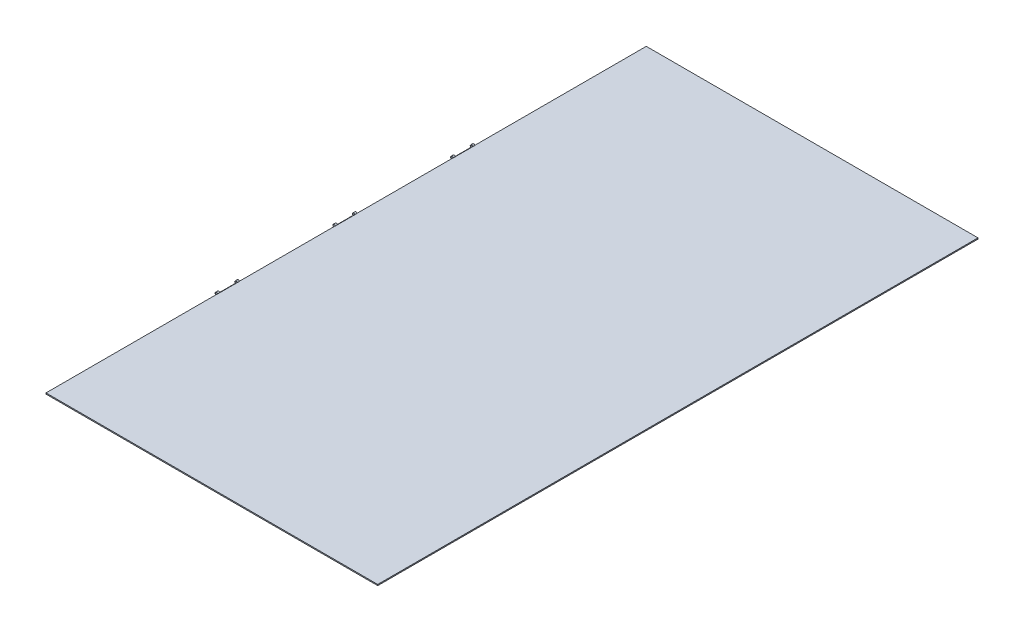
ISO-10303-21;
HEADER;
FILE_DESCRIPTION(('STEP AP214'),'2;1');
FILE_NAME('part.step','',(''),(''),'','','');
FILE_SCHEMA(('AUTOMOTIVE_DESIGN { 1 0 10303 214 1 1 1 1 }'));
ENDSEC;
DATA;
#1=APPLICATION_CONTEXT('core data for automotive mechanical design processes');
#2=APPLICATION_PROTOCOL_DEFINITION('international standard','automotive_design',2000,#1);
#3=PRODUCT_CONTEXT('',#1,'mechanical');
#4=PRODUCT('Part','Part','',(#3));
#5=PRODUCT_RELATED_PRODUCT_CATEGORY('part','',(#4));
#6=PRODUCT_DEFINITION_FORMATION('','',#4);
#7=PRODUCT_DEFINITION_CONTEXT('part definition',#1,'design');
#8=PRODUCT_DEFINITION('design','',#6,#7);
#9=PRODUCT_DEFINITION_SHAPE('','',#8);
#10=(LENGTH_UNIT() NAMED_UNIT(*) SI_UNIT(.MILLI.,.METRE.));
#11=(NAMED_UNIT(*) PLANE_ANGLE_UNIT() SI_UNIT($,.RADIAN.));
#12=(NAMED_UNIT(*) SI_UNIT($,.STERADIAN.) SOLID_ANGLE_UNIT());
#13=UNCERTAINTY_MEASURE_WITH_UNIT(LENGTH_MEASURE(1.E-05),#10,'distance_accuracy_value','');
#14=(GEOMETRIC_REPRESENTATION_CONTEXT(3) GLOBAL_UNCERTAINTY_ASSIGNED_CONTEXT((#13)) GLOBAL_UNIT_ASSIGNED_CONTEXT((#10,
#11,#12)) REPRESENTATION_CONTEXT('',''));
#15=CARTESIAN_POINT('',(0.,0.,0.));
#16=DIRECTION('',(0.,0.,1.));
#17=DIRECTION('',(1.,0.,0.));
#18=AXIS2_PLACEMENT_3D('',#15,#16,#17);
#19=CARTESIAN_POINT('',(-765.75,2.79900864663186,50.));
#20=DIRECTION('',(0.,0.,-1.));
#21=DIRECTION('',(-1.,0.,0.));
#22=AXIS2_PLACEMENT_3D('',#19,#20,#21);
#23=CYLINDRICAL_SURFACE('',#22,5.99999999999999);
#24=DIRECTION('',(0.,0.,-1.));
#25=VECTOR('',#24,1.);
#26=CARTESIAN_POINT('',(-760.168276515054,5.,50.));
#27=LINE('',#26,#25);
#28=CARTESIAN_POINT('',(-760.168276515054,5.,-50.));
#29=VERTEX_POINT('',#28);
#30=CARTESIAN_POINT('',(-760.168276515054,5.,50.));
#31=VERTEX_POINT('',#30);
#32=EDGE_CURVE('E378',#29,#31,#27,.F.);
#33=ORIENTED_EDGE('',*,*,#32,.F.);
#34=CARTESIAN_POINT('',(-765.75,2.79900864663186,-50.));
#35=DIRECTION('',(0.,0.,1.));
#36=DIRECTION('',(1.,0.,0.));
#37=AXIS2_PLACEMENT_3D('',#34,#35,#36);
#38=CIRCLE('',#37,5.99999999999999);
#39=CARTESIAN_POINT('',(-760.442877371298,0.,-50.));
#40=VERTEX_POINT('',#39);
#41=EDGE_CURVE('E370',#29,#40,#38,.T.);
#42=ORIENTED_EDGE('',*,*,#41,.T.);
#43=DIRECTION('',(0.,0.,-1.));
#44=VECTOR('',#43,1.);
#45=CARTESIAN_POINT('',(-760.442877371298,0.,50.));
#46=LINE('',#45,#44);
#47=CARTESIAN_POINT('',(-760.442877371298,0.,50.));
#48=VERTEX_POINT('',#47);
#49=EDGE_CURVE('E450',#40,#48,#46,.F.);
#50=ORIENTED_EDGE('',*,*,#49,.T.);
#51=CARTESIAN_POINT('',(-765.75,2.79900864663186,50.));
#52=DIRECTION('',(0.,0.,1.));
#53=DIRECTION('',(1.,0.,0.));
#54=AXIS2_PLACEMENT_3D('',#51,#52,#53);
#55=CIRCLE('',#54,5.99999999999999);
#56=EDGE_CURVE('E374',#31,#48,#55,.T.);
#57=ORIENTED_EDGE('',*,*,#56,.F.);
#58=EDGE_LOOP('',(#33,#42,#50,#57));
#59=FACE_BOUND('',#58,.T.);
#60=CARTESIAN_POINT('',(-765.75,2.79900864663186,40.0000000000001));
#61=DIRECTION('',(0.,0.,-1.));
#62=DIRECTION('',(-1.,0.,0.));
#63=AXIS2_PLACEMENT_3D('',#60,#61,#62);
#64=CIRCLE('',#63,5.99999999999999);
#65=CARTESIAN_POINT('',(-760.75,-0.51761614372385,40.0000000000001));
#66=VERTEX_POINT('',#65);
#67=CARTESIAN_POINT('',(-760.75,6.11563343698757,40.0000000000001));
#68=VERTEX_POINT('',#67);
#69=EDGE_CURVE('E267',#66,#68,#64,.T.);
#70=ORIENTED_EDGE('',*,*,#69,.F.);
#71=DIRECTION('',(0.,0.,-1.));
#72=VECTOR('',#71,1.);
#73=CARTESIAN_POINT('',(-760.75,-0.51761614372385,50.));
#74=LINE('',#73,#72);
#75=CARTESIAN_POINT('',(-760.75,-0.51761614372385,-39.9999999999999));
#76=VERTEX_POINT('',#75);
#77=EDGE_CURVE('E256',#76,#66,#74,.F.);
#78=ORIENTED_EDGE('',*,*,#77,.F.);
#79=CARTESIAN_POINT('',(-765.75,2.79900864663186,-39.9999999999999));
#80=DIRECTION('',(0.,0.,1.));
#81=DIRECTION('',(1.,0.,0.));
#82=AXIS2_PLACEMENT_3D('',#79,#80,#81);
#83=CIRCLE('',#82,5.99999999999999);
#84=CARTESIAN_POINT('',(-760.75,6.11563343698757,-39.9999999999999));
#85=VERTEX_POINT('',#84);
#86=EDGE_CURVE('E59',#85,#76,#83,.T.);
#87=ORIENTED_EDGE('',*,*,#86,.F.);
#88=DIRECTION('',(0.,0.,-1.));
#89=VECTOR('',#88,1.);
#90=CARTESIAN_POINT('',(-760.75,6.11563343698757,50.));
#91=LINE('',#90,#89);
#92=EDGE_CURVE('E261',#68,#85,#91,.T.);
#93=ORIENTED_EDGE('',*,*,#92,.F.);
#94=EDGE_LOOP('',(#70,#78,#87,#93));
#95=FACE_BOUND('',#94,.T.);
#96=ADVANCED_FACE('F43',(#59,#95),#23,.T.);
#97=CARTESIAN_POINT('',(-765.75,2.79900864663186,50.));
#98=DIRECTION('',(0.,0.,-1.));
#99=DIRECTION('',(-1.,0.,0.));
#100=AXIS2_PLACEMENT_3D('',#97,#98,#99);
#101=CYLINDRICAL_SURFACE('',#100,5.00000000000004);
#102=CARTESIAN_POINT('',(-765.75,2.79900864663186,-50.));
#103=DIRECTION('',(0.,0.,1.));
#104=DIRECTION('',(1.,0.,0.));
#105=AXIS2_PLACEMENT_3D('',#102,#103,#104);
#106=CIRCLE('',#105,5.00000000000004);
#107=CARTESIAN_POINT('',(-760.75,2.79900864663186,-50.));
#108=VERTEX_POINT('',#107);
#109=EDGE_CURVE('E365',#108,#108,#106,.T.);
#110=ORIENTED_EDGE('',*,*,#109,.F.);
#111=EDGE_LOOP('',(#110));
#112=FACE_BOUND('',#111,.T.);
#113=CARTESIAN_POINT('',(-765.75,2.79900864663186,-39.9999999999999));
#114=DIRECTION('',(0.,0.,1.));
#115=DIRECTION('',(1.,0.,0.));
#116=AXIS2_PLACEMENT_3D('',#113,#114,#115);
#117=CIRCLE('',#116,5.00000000000004);
#118=CARTESIAN_POINT('',(-760.75,2.79900864663186,-39.9999999999999));
#119=VERTEX_POINT('',#118);
#120=EDGE_CURVE('E11',#119,#119,#117,.T.);
#121=ORIENTED_EDGE('',*,*,#120,.T.);
#122=EDGE_LOOP('',(#121));
#123=FACE_BOUND('',#122,.T.);
#124=ADVANCED_FACE('F547',(#112,#123),#101,.F.);
#125=CARTESIAN_POINT('',(-765.75,2.79900864663186,50.));
#126=DIRECTION('',(0.,0.,1.));
#127=DIRECTION('',(1.,0.,0.));
#128=AXIS2_PLACEMENT_3D('',#125,#126,#127);
#129=CIRCLE('',#128,5.00000000000004);
#130=CARTESIAN_POINT('',(-760.75,2.79900864663186,50.));
#131=VERTEX_POINT('',#130);
#132=EDGE_CURVE('E366',#131,#131,#129,.T.);
#133=ORIENTED_EDGE('',*,*,#132,.T.);
#134=EDGE_LOOP('',(#133));
#135=FACE_BOUND('',#134,.T.);
#136=CARTESIAN_POINT('',(-765.75,2.79900864663186,40.0000000000001));
#137=DIRECTION('',(0.,0.,-1.));
#138=DIRECTION('',(-1.,0.,0.));
#139=AXIS2_PLACEMENT_3D('',#136,#137,#138);
#140=CIRCLE('',#139,5.00000000000004);
#141=CARTESIAN_POINT('',(-760.75,2.79900864663186,40.0000000000001));
#142=VERTEX_POINT('',#141);
#143=EDGE_CURVE('E52',#142,#142,#140,.T.);
#144=ORIENTED_EDGE('',*,*,#143,.T.);
#145=EDGE_LOOP('',(#144));
#146=FACE_BOUND('',#145,.T.);
#147=ADVANCED_FACE('F500',(#135,#146),#101,.F.);
#148=CARTESIAN_POINT('',(-765.75,2.79900864663186,590.));
#149=DIRECTION('',(0.,0.,-1.));
#150=DIRECTION('',(-1.,0.,0.));
#151=AXIS2_PLACEMENT_3D('',#148,#149,#150);
#152=CYLINDRICAL_SURFACE('',#151,5.99999999999999);
#153=DIRECTION('',(0.,0.,-1.));
#154=VECTOR('',#153,1.);
#155=CARTESIAN_POINT('',(-760.168276515053,5.,590.));
#156=LINE('',#155,#154);
#157=CARTESIAN_POINT('',(-760.168276515053,5.,490.));
#158=VERTEX_POINT('',#157);
#159=CARTESIAN_POINT('',(-760.168276515053,5.,590.));
#160=VERTEX_POINT('',#159);
#161=EDGE_CURVE('E285',#158,#160,#156,.F.);
#162=ORIENTED_EDGE('',*,*,#161,.F.);
#163=CARTESIAN_POINT('',(-765.75,2.79900864663186,490.));
#164=DIRECTION('',(0.,0.,1.));
#165=DIRECTION('',(1.,0.,0.));
#166=AXIS2_PLACEMENT_3D('',#163,#164,#165);
#167=CIRCLE('',#166,5.99999999999999);
#168=CARTESIAN_POINT('',(-760.442877371298,0.,490.));
#169=VERTEX_POINT('',#168);
#170=EDGE_CURVE('E277',#158,#169,#167,.T.);
#171=ORIENTED_EDGE('',*,*,#170,.T.);
#172=DIRECTION('',(0.,0.,-1.));
#173=VECTOR('',#172,1.);
#174=CARTESIAN_POINT('',(-760.442877371298,0.,590.));
#175=LINE('',#174,#173);
#176=CARTESIAN_POINT('',(-760.442877371298,0.,590.));
#177=VERTEX_POINT('',#176);
#178=EDGE_CURVE('E480',#169,#177,#175,.F.);
#179=ORIENTED_EDGE('',*,*,#178,.T.);
#180=CARTESIAN_POINT('',(-765.75,2.79900864663186,590.));
#181=DIRECTION('',(0.,0.,1.));
#182=DIRECTION('',(1.,0.,0.));
#183=AXIS2_PLACEMENT_3D('',#180,#181,#182);
#184=CIRCLE('',#183,5.99999999999999);
#185=EDGE_CURVE('E281',#160,#177,#184,.T.);
#186=ORIENTED_EDGE('',*,*,#185,.F.);
#187=EDGE_LOOP('',(#162,#171,#179,#186));
#188=FACE_BOUND('',#187,.T.);
#189=CARTESIAN_POINT('',(-765.75,2.79900864663186,580.));
#190=DIRECTION('',(0.,0.,-1.));
#191=DIRECTION('',(-1.,0.,0.));
#192=AXIS2_PLACEMENT_3D('',#189,#190,#191);
#193=CIRCLE('',#192,5.99999999999999);
#194=CARTESIAN_POINT('',(-760.75,-0.51761614372385,580.));
#195=VERTEX_POINT('',#194);
#196=CARTESIAN_POINT('',(-760.75,6.11563343698757,580.));
#197=VERTEX_POINT('',#196);
#198=EDGE_CURVE('E240',#195,#197,#193,.T.);
#199=ORIENTED_EDGE('',*,*,#198,.F.);
#200=DIRECTION('',(0.,0.,-1.));
#201=VECTOR('',#200,1.);
#202=CARTESIAN_POINT('',(-760.75,-0.51761614372385,590.));
#203=LINE('',#202,#201);
#204=CARTESIAN_POINT('',(-760.75,-0.51761614372385,500.));
#205=VERTEX_POINT('',#204);
#206=EDGE_CURVE('E241',#205,#195,#203,.F.);
#207=ORIENTED_EDGE('',*,*,#206,.F.);
#208=CARTESIAN_POINT('',(-765.75,2.79900864663186,500.));
#209=DIRECTION('',(0.,0.,1.));
#210=DIRECTION('',(1.,0.,0.));
#211=AXIS2_PLACEMENT_3D('',#208,#209,#210);
#212=CIRCLE('',#211,5.99999999999999);
#213=CARTESIAN_POINT('',(-760.75,6.11563343698757,500.));
#214=VERTEX_POINT('',#213);
#215=EDGE_CURVE('E246',#214,#205,#212,.T.);
#216=ORIENTED_EDGE('',*,*,#215,.F.);
#217=DIRECTION('',(0.,0.,-1.));
#218=VECTOR('',#217,1.);
#219=CARTESIAN_POINT('',(-760.75,6.11563343698757,590.));
#220=LINE('',#219,#218);
#221=EDGE_CURVE('E229',#197,#214,#220,.T.);
#222=ORIENTED_EDGE('',*,*,#221,.F.);
#223=EDGE_LOOP('',(#199,#207,#216,#222));
#224=FACE_BOUND('',#223,.T.);
#225=ADVANCED_FACE('F253',(#188,#224),#152,.T.);
#226=CARTESIAN_POINT('',(-765.75,2.79900864663186,590.));
#227=DIRECTION('',(0.,0.,-1.));
#228=DIRECTION('',(-1.,0.,0.));
#229=AXIS2_PLACEMENT_3D('',#226,#227,#228);
#230=CYLINDRICAL_SURFACE('',#229,5.00000000000004);
#231=CARTESIAN_POINT('',(-765.75,2.79900864663186,490.));
#232=DIRECTION('',(0.,0.,1.));
#233=DIRECTION('',(1.,0.,0.));
#234=AXIS2_PLACEMENT_3D('',#231,#232,#233);
#235=CIRCLE('',#234,5.00000000000004);
#236=CARTESIAN_POINT('',(-760.75,2.79900864663186,490.));
#237=VERTEX_POINT('',#236);
#238=EDGE_CURVE('E272',#237,#237,#235,.T.);
#239=ORIENTED_EDGE('',*,*,#238,.F.);
#240=EDGE_LOOP('',(#239));
#241=FACE_BOUND('',#240,.T.);
#242=CARTESIAN_POINT('',(-765.75,2.79900864663186,500.));
#243=DIRECTION('',(0.,0.,1.));
#244=DIRECTION('',(1.,0.,0.));
#245=AXIS2_PLACEMENT_3D('',#242,#243,#244);
#246=CIRCLE('',#245,5.00000000000004);
#247=CARTESIAN_POINT('',(-760.75,2.79900864663186,500.));
#248=VERTEX_POINT('',#247);
#249=EDGE_CURVE('E248',#248,#248,#246,.T.);
#250=ORIENTED_EDGE('',*,*,#249,.T.);
#251=EDGE_LOOP('',(#250));
#252=FACE_BOUND('',#251,.T.);
#253=ADVANCED_FACE('F530',(#241,#252),#230,.F.);
#254=CARTESIAN_POINT('',(-765.75,2.79900864663186,590.));
#255=DIRECTION('',(0.,0.,1.));
#256=DIRECTION('',(1.,0.,0.));
#257=AXIS2_PLACEMENT_3D('',#254,#255,#256);
#258=CIRCLE('',#257,5.00000000000004);
#259=CARTESIAN_POINT('',(-760.75,2.79900864663186,590.));
#260=VERTEX_POINT('',#259);
#261=EDGE_CURVE('E273',#260,#260,#258,.T.);
#262=ORIENTED_EDGE('',*,*,#261,.T.);
#263=EDGE_LOOP('',(#262));
#264=FACE_BOUND('',#263,.T.);
#265=CARTESIAN_POINT('',(-765.75,2.79900864663186,580.));
#266=DIRECTION('',(0.,0.,-1.));
#267=DIRECTION('',(-1.,0.,0.));
#268=AXIS2_PLACEMENT_3D('',#265,#266,#267);
#269=CIRCLE('',#268,5.00000000000004);
#270=CARTESIAN_POINT('',(-760.75,2.79900864663186,580.));
#271=VERTEX_POINT('',#270);
#272=EDGE_CURVE('E491',#271,#271,#269,.T.);
#273=ORIENTED_EDGE('',*,*,#272,.T.);
#274=EDGE_LOOP('',(#273));
#275=FACE_BOUND('',#274,.T.);
#276=ADVANCED_FACE('F527',(#264,#275),#230,.F.);
#277=CARTESIAN_POINT('',(-760.75,5.,-1376.6));
#278=DIRECTION('',(1.,0.,0.));
#279=DIRECTION('',(0.,0.,-1.));
#280=AXIS2_PLACEMENT_3D('',#277,#278,#279);
#281=PLANE('',#280);
#282=DIRECTION('',(0.,-1.,0.));
#283=VECTOR('',#282,1.);
#284=CARTESIAN_POINT('',(-760.75,5.,490.));
#285=LINE('',#284,#283);
#286=CARTESIAN_POINT('',(-760.75,5.,490.));
#287=VERTEX_POINT('',#286);
#288=EDGE_CURVE('E295',#287,#237,#285,.T.);
#289=ORIENTED_EDGE('',*,*,#288,.F.);
#290=DIRECTION('',(0.,0.,1.));
#291=VECTOR('',#290,1.);
#292=CARTESIAN_POINT('',(-760.75,5.,-1376.6));
#293=LINE('',#292,#291);
#294=CARTESIAN_POINT('',(-760.75,5.,49.9999999999996));
#295=VERTEX_POINT('',#294);
#296=EDGE_CURVE('E416',#295,#287,#293,.T.);
#297=ORIENTED_EDGE('',*,*,#296,.F.);
#298=DIRECTION('',(0.,-1.,0.));
#299=VECTOR('',#298,1.);
#300=CARTESIAN_POINT('',(-760.75,5.,50.));
#301=LINE('',#300,#299);
#302=EDGE_CURVE('E395',#295,#131,#301,.T.);
#303=ORIENTED_EDGE('',*,*,#302,.T.);
#304=CARTESIAN_POINT('',(-760.75,0.,49.9999999999996));
#305=VERTEX_POINT('',#304);
#306=EDGE_CURVE('E392',#131,#305,#301,.T.);
#307=ORIENTED_EDGE('',*,*,#306,.T.);
#308=DIRECTION('',(0.,0.,1.));
#309=VECTOR('',#308,1.);
#310=CARTESIAN_POINT('',(-760.75,0.,-1376.6));
#311=LINE('',#310,#309);
#312=CARTESIAN_POINT('',(-760.75,0.,490.));
#313=VERTEX_POINT('',#312);
#314=EDGE_CURVE('E432',#305,#313,#311,.T.);
#315=ORIENTED_EDGE('',*,*,#314,.T.);
#316=EDGE_CURVE('E291',#237,#313,#285,.T.);
#317=ORIENTED_EDGE('',*,*,#316,.F.);
#318=EDGE_LOOP('',(#289,#297,#303,#307,#315,#317));
#319=FACE_BOUND('',#318,.T.);
#320=ADVANCED_FACE('F529',(#319),#281,.F.);
#321=CARTESIAN_POINT('',(-765.75,2.79900864663186,-490.));
#322=DIRECTION('',(0.,0.,-1.));
#323=DIRECTION('',(-1.,0.,0.));
#324=AXIS2_PLACEMENT_3D('',#321,#322,#323);
#325=CYLINDRICAL_SURFACE('',#324,5.99999999999999);
#326=DIRECTION('',(0.,0.,-1.));
#327=VECTOR('',#326,1.);
#328=CARTESIAN_POINT('',(-760.168276515054,5.,-490.));
#329=LINE('',#328,#327);
#330=CARTESIAN_POINT('',(-760.168276515054,5.,-590.));
#331=VERTEX_POINT('',#330);
#332=CARTESIAN_POINT('',(-760.168276515054,5.,-490.));
#333=VERTEX_POINT('',#332);
#334=EDGE_CURVE('E343',#331,#333,#329,.F.);
#335=ORIENTED_EDGE('',*,*,#334,.F.);
#336=CARTESIAN_POINT('',(-765.75,2.79900864663186,-590.));
#337=DIRECTION('',(0.,0.,1.));
#338=DIRECTION('',(1.,0.,0.));
#339=AXIS2_PLACEMENT_3D('',#336,#337,#338);
#340=CIRCLE('',#339,5.99999999999999);
#341=CARTESIAN_POINT('',(-760.442877371298,0.,-590.));
#342=VERTEX_POINT('',#341);
#343=EDGE_CURVE('E335',#331,#342,#340,.T.);
#344=ORIENTED_EDGE('',*,*,#343,.T.);
#345=DIRECTION('',(0.,0.,-1.));
#346=VECTOR('',#345,1.);
#347=CARTESIAN_POINT('',(-760.442877371298,0.,-490.));
#348=LINE('',#347,#346);
#349=CARTESIAN_POINT('',(-760.442877371298,0.,-490.));
#350=VERTEX_POINT('',#349);
#351=EDGE_CURVE('E461',#342,#350,#348,.F.);
#352=ORIENTED_EDGE('',*,*,#351,.T.);
#353=CARTESIAN_POINT('',(-765.75,2.79900864663186,-490.));
#354=DIRECTION('',(0.,0.,1.));
#355=DIRECTION('',(1.,0.,0.));
#356=AXIS2_PLACEMENT_3D('',#353,#354,#355);
#357=CIRCLE('',#356,5.99999999999999);
#358=EDGE_CURVE('E339',#333,#350,#357,.T.);
#359=ORIENTED_EDGE('',*,*,#358,.F.);
#360=EDGE_LOOP('',(#335,#344,#352,#359));
#361=FACE_BOUND('',#360,.T.);
#362=CARTESIAN_POINT('',(-765.75,2.79900864663186,-500.));
#363=DIRECTION('',(0.,0.,-1.));
#364=DIRECTION('',(-1.,0.,0.));
#365=AXIS2_PLACEMENT_3D('',#362,#363,#364);
#366=CIRCLE('',#365,5.99999999999999);
#367=CARTESIAN_POINT('',(-760.75,-0.51761614372385,-500.));
#368=VERTEX_POINT('',#367);
#369=CARTESIAN_POINT('',(-760.75,6.11563343698757,-500.));
#370=VERTEX_POINT('',#369);
#371=EDGE_CURVE('E324',#368,#370,#366,.T.);
#372=ORIENTED_EDGE('',*,*,#371,.F.);
#373=DIRECTION('',(0.,0.,-1.));
#374=VECTOR('',#373,1.);
#375=CARTESIAN_POINT('',(-760.75,-0.51761614372385,-490.));
#376=LINE('',#375,#374);
#377=CARTESIAN_POINT('',(-760.75,-0.51761614372385,-580.));
#378=VERTEX_POINT('',#377);
#379=EDGE_CURVE('E317',#378,#368,#376,.F.);
#380=ORIENTED_EDGE('',*,*,#379,.F.);
#381=CARTESIAN_POINT('',(-765.75,2.79900864663186,-580.));
#382=DIRECTION('',(0.,0.,1.));
#383=DIRECTION('',(1.,0.,0.));
#384=AXIS2_PLACEMENT_3D('',#381,#382,#383);
#385=CIRCLE('',#384,5.99999999999999);
#386=CARTESIAN_POINT('',(-760.75,6.11563343698757,-580.));
#387=VERTEX_POINT('',#386);
#388=EDGE_CURVE('E327',#387,#378,#385,.T.);
#389=ORIENTED_EDGE('',*,*,#388,.F.);
#390=DIRECTION('',(0.,0.,-1.));
#391=VECTOR('',#390,1.);
#392=CARTESIAN_POINT('',(-760.75,6.11563343698757,-490.));
#393=LINE('',#392,#391);
#394=EDGE_CURVE('E321',#370,#387,#393,.T.);
#395=ORIENTED_EDGE('',*,*,#394,.F.);
#396=EDGE_LOOP('',(#372,#380,#389,#395));
#397=FACE_BOUND('',#396,.T.);
#398=ADVANCED_FACE('F538',(#361,#397),#325,.T.);
#399=CARTESIAN_POINT('',(-765.75,2.79900864663186,-490.));
#400=DIRECTION('',(0.,0.,-1.));
#401=DIRECTION('',(-1.,0.,0.));
#402=AXIS2_PLACEMENT_3D('',#399,#400,#401);
#403=CYLINDRICAL_SURFACE('',#402,5.00000000000004);
#404=CARTESIAN_POINT('',(-765.75,2.79900864663186,-590.));
#405=DIRECTION('',(0.,0.,1.));
#406=DIRECTION('',(1.,0.,0.));
#407=AXIS2_PLACEMENT_3D('',#404,#405,#406);
#408=CIRCLE('',#407,5.00000000000004);
#409=CARTESIAN_POINT('',(-760.75,2.79900864663186,-590.));
#410=VERTEX_POINT('',#409);
#411=EDGE_CURVE('E330',#410,#410,#408,.T.);
#412=ORIENTED_EDGE('',*,*,#411,.F.);
#413=EDGE_LOOP('',(#412));
#414=FACE_BOUND('',#413,.T.);
#415=CARTESIAN_POINT('',(-765.75,2.79900864663186,-580.));
#416=DIRECTION('',(0.,0.,1.));
#417=DIRECTION('',(1.,0.,0.));
#418=AXIS2_PLACEMENT_3D('',#415,#416,#417);
#419=CIRCLE('',#418,5.00000000000004);
#420=CARTESIAN_POINT('',(-760.75,2.79900864663186,-580.));
#421=VERTEX_POINT('',#420);
#422=EDGE_CURVE('E476',#421,#421,#419,.T.);
#423=ORIENTED_EDGE('',*,*,#422,.T.);
#424=EDGE_LOOP('',(#423));
#425=FACE_BOUND('',#424,.T.);
#426=ADVANCED_FACE('F638',(#414,#425),#403,.F.);
#427=CARTESIAN_POINT('',(-765.75,2.79900864663186,-490.));
#428=DIRECTION('',(0.,0.,1.));
#429=DIRECTION('',(1.,0.,0.));
#430=AXIS2_PLACEMENT_3D('',#427,#428,#429);
#431=CIRCLE('',#430,5.00000000000004);
#432=CARTESIAN_POINT('',(-760.75,2.79900864663186,-490.));
#433=VERTEX_POINT('',#432);
#434=EDGE_CURVE('E331',#433,#433,#431,.T.);
#435=ORIENTED_EDGE('',*,*,#434,.T.);
#436=EDGE_LOOP('',(#435));
#437=FACE_BOUND('',#436,.T.);
#438=CARTESIAN_POINT('',(-765.75,2.79900864663186,-500.));
#439=DIRECTION('',(0.,0.,-1.));
#440=DIRECTION('',(-1.,0.,0.));
#441=AXIS2_PLACEMENT_3D('',#438,#439,#440);
#442=CIRCLE('',#441,5.00000000000004);
#443=CARTESIAN_POINT('',(-760.75,2.79900864663186,-500.));
#444=VERTEX_POINT('',#443);
#445=EDGE_CURVE('E472',#444,#444,#442,.T.);
#446=ORIENTED_EDGE('',*,*,#445,.T.);
#447=EDGE_LOOP('',(#446));
#448=FACE_BOUND('',#447,.T.);
#449=ADVANCED_FACE('F641',(#437,#448),#403,.F.);
#450=DIRECTION('',(0.,-1.,0.));
#451=VECTOR('',#450,1.);
#452=CARTESIAN_POINT('',(-760.75,5.,-590.));
#453=LINE('',#452,#451);
#454=CARTESIAN_POINT('',(-760.75,5.,-590.));
#455=VERTEX_POINT('',#454);
#456=EDGE_CURVE('E353',#455,#410,#453,.T.);
#457=ORIENTED_EDGE('',*,*,#456,.F.);
#458=CARTESIAN_POINT('',(-760.75,5.,-1376.6));
#459=VERTEX_POINT('',#458);
#460=EDGE_CURVE('E410',#459,#455,#293,.T.);
#461=ORIENTED_EDGE('',*,*,#460,.F.);
#462=DIRECTION('',(0.,-1.,0.));
#463=VECTOR('',#462,1.);
#464=CARTESIAN_POINT('',(-760.75,5.,-1376.6));
#465=LINE('',#464,#463);
#466=CARTESIAN_POINT('',(-760.75,0.,-1376.6));
#467=VERTEX_POINT('',#466);
#468=EDGE_CURVE('E442',#459,#467,#465,.T.);
#469=ORIENTED_EDGE('',*,*,#468,.T.);
#470=CARTESIAN_POINT('',(-760.75,0.,-590.));
#471=VERTEX_POINT('',#470);
#472=EDGE_CURVE('E427',#467,#471,#311,.T.);
#473=ORIENTED_EDGE('',*,*,#472,.T.);
#474=EDGE_CURVE('E349',#410,#471,#453,.T.);
#475=ORIENTED_EDGE('',*,*,#474,.F.);
#476=EDGE_LOOP('',(#457,#461,#469,#473,#475));
#477=FACE_BOUND('',#476,.T.);
#478=ADVANCED_FACE('F541',(#477),#281,.F.);
#479=CARTESIAN_POINT('',(-760.75,5.,-490.));
#480=VERTEX_POINT('',#479);
#481=CARTESIAN_POINT('',(-760.75,5.,-50.0000000000005));
#482=VERTEX_POINT('',#481);
#483=EDGE_CURVE('E415',#480,#482,#293,.T.);
#484=ORIENTED_EDGE('',*,*,#483,.F.);
#485=DIRECTION('',(0.,-1.,0.));
#486=VECTOR('',#485,1.);
#487=CARTESIAN_POINT('',(-760.75,5.,-490.));
#488=LINE('',#487,#486);
#489=EDGE_CURVE('E360',#480,#433,#488,.T.);
#490=ORIENTED_EDGE('',*,*,#489,.T.);
#491=CARTESIAN_POINT('',(-760.75,0.,-490.));
#492=VERTEX_POINT('',#491);
#493=EDGE_CURVE('E357',#433,#492,#488,.T.);
#494=ORIENTED_EDGE('',*,*,#493,.T.);
#495=CARTESIAN_POINT('',(-760.75,0.,-50.0000000000005));
#496=VERTEX_POINT('',#495);
#497=EDGE_CURVE('E431',#492,#496,#311,.T.);
#498=ORIENTED_EDGE('',*,*,#497,.T.);
#499=DIRECTION('',(0.,-1.,0.));
#500=VECTOR('',#499,1.);
#501=CARTESIAN_POINT('',(-760.75,5.,-50.));
#502=LINE('',#501,#500);
#503=EDGE_CURVE('E384',#108,#496,#502,.T.);
#504=ORIENTED_EDGE('',*,*,#503,.F.);
#505=EDGE_CURVE('E388',#482,#108,#502,.T.);
#506=ORIENTED_EDGE('',*,*,#505,.F.);
#507=EDGE_LOOP('',(#484,#490,#494,#498,#504,#506));
#508=FACE_BOUND('',#507,.T.);
#509=ADVANCED_FACE('F577',(#508),#281,.F.);
#510=CARTESIAN_POINT('',(760.75,5.,-1376.6));
#511=DIRECTION('',(-1.,0.,0.));
#512=DIRECTION('',(0.,0.,1.));
#513=AXIS2_PLACEMENT_3D('',#510,#511,#512);
#514=PLANE('',#513);
#515=DIRECTION('',(0.,0.,-1.));
#516=VECTOR('',#515,1.);
#517=CARTESIAN_POINT('',(760.75,0.,-1376.6));
#518=LINE('',#517,#516);
#519=CARTESIAN_POINT('',(760.75,0.,1376.6));
#520=VERTEX_POINT('',#519);
#521=CARTESIAN_POINT('',(760.75,0.,-1376.6));
#522=VERTEX_POINT('',#521);
#523=EDGE_CURVE('E400',#520,#522,#518,.T.);
#524=ORIENTED_EDGE('',*,*,#523,.T.);
#525=DIRECTION('',(0.,-1.,0.));
#526=VECTOR('',#525,1.);
#527=CARTESIAN_POINT('',(760.75,5.,-1376.6));
#528=LINE('',#527,#526);
#529=CARTESIAN_POINT('',(760.75,5.,-1376.6));
#530=VERTEX_POINT('',#529);
#531=EDGE_CURVE('E446',#530,#522,#528,.T.);
#532=ORIENTED_EDGE('',*,*,#531,.F.);
#533=DIRECTION('',(0.,0.,-1.));
#534=VECTOR('',#533,1.);
#535=CARTESIAN_POINT('',(760.75,5.,-1376.6));
#536=LINE('',#535,#534);
#537=CARTESIAN_POINT('',(760.75,5.,1376.6));
#538=VERTEX_POINT('',#537);
#539=EDGE_CURVE('E401',#538,#530,#536,.T.);
#540=ORIENTED_EDGE('',*,*,#539,.F.);
#541=DIRECTION('',(0.,-1.,0.));
#542=VECTOR('',#541,1.);
#543=CARTESIAN_POINT('',(760.75,5.,1376.6));
#544=LINE('',#543,#542);
#545=EDGE_CURVE('E419',#538,#520,#544,.T.);
#546=ORIENTED_EDGE('',*,*,#545,.T.);
#547=EDGE_LOOP('',(#524,#532,#540,#546));
#548=FACE_BOUND('',#547,.T.);
#549=ADVANCED_FACE('F45',(#548),#514,.F.);
#550=CARTESIAN_POINT('',(-760.75,5.,-1376.6));
#551=DIRECTION('',(0.,0.,1.));
#552=DIRECTION('',(1.,0.,0.));
#553=AXIS2_PLACEMENT_3D('',#550,#551,#552);
#554=PLANE('',#553);
#555=DIRECTION('',(-1.,0.,0.));
#556=VECTOR('',#555,1.);
#557=CARTESIAN_POINT('',(-760.75,0.,-1376.6));
#558=LINE('',#557,#556);
#559=EDGE_CURVE('E423',#522,#467,#558,.T.);
#560=ORIENTED_EDGE('',*,*,#559,.T.);
#561=ORIENTED_EDGE('',*,*,#468,.F.);
#562=DIRECTION('',(-1.,0.,0.));
#563=VECTOR('',#562,1.);
#564=CARTESIAN_POINT('',(-760.75,5.,-1376.6));
#565=LINE('',#564,#563);
#566=EDGE_CURVE('E405',#530,#459,#565,.T.);
#567=ORIENTED_EDGE('',*,*,#566,.F.);
#568=ORIENTED_EDGE('',*,*,#531,.T.);
#569=EDGE_LOOP('',(#560,#561,#567,#568));
#570=FACE_BOUND('',#569,.T.);
#571=ADVANCED_FACE('F575',(#570),#554,.F.);
#572=CARTESIAN_POINT('',(-760.75,5.,590.));
#573=VERTEX_POINT('',#572);
#574=CARTESIAN_POINT('',(-760.75,5.,1376.6));
#575=VERTEX_POINT('',#574);
#576=EDGE_CURVE('E409',#573,#575,#293,.T.);
#577=ORIENTED_EDGE('',*,*,#576,.F.);
#578=DIRECTION('',(0.,-1.,0.));
#579=VECTOR('',#578,1.);
#580=CARTESIAN_POINT('',(-760.75,5.,590.));
#581=LINE('',#580,#579);
#582=EDGE_CURVE('E302',#573,#260,#581,.T.);
#583=ORIENTED_EDGE('',*,*,#582,.T.);
#584=CARTESIAN_POINT('',(-760.75,0.,590.));
#585=VERTEX_POINT('',#584);
#586=EDGE_CURVE('E299',#260,#585,#581,.T.);
#587=ORIENTED_EDGE('',*,*,#586,.T.);
#588=CARTESIAN_POINT('',(-760.75,0.,1376.6));
#589=VERTEX_POINT('',#588);
#590=EDGE_CURVE('E426',#585,#589,#311,.T.);
#591=ORIENTED_EDGE('',*,*,#590,.T.);
#592=DIRECTION('',(0.,-1.,0.));
#593=VECTOR('',#592,1.);
#594=CARTESIAN_POINT('',(-760.75,5.,1376.6));
#595=LINE('',#594,#593);
#596=EDGE_CURVE('E438',#575,#589,#595,.T.);
#597=ORIENTED_EDGE('',*,*,#596,.F.);
#598=EDGE_LOOP('',(#577,#583,#587,#591,#597));
#599=FACE_BOUND('',#598,.T.);
#600=ADVANCED_FACE('F542',(#599),#281,.F.);
#601=CARTESIAN_POINT('',(-760.75,5.,1376.6));
#602=DIRECTION('',(0.,0.,-1.));
#603=DIRECTION('',(-1.,0.,0.));
#604=AXIS2_PLACEMENT_3D('',#601,#602,#603);
#605=PLANE('',#604);
#606=DIRECTION('',(1.,0.,0.));
#607=VECTOR('',#606,1.);
#608=CARTESIAN_POINT('',(-760.75,0.,1376.6));
#609=LINE('',#608,#607);
#610=EDGE_CURVE('E406',#589,#520,#609,.T.);
#611=ORIENTED_EDGE('',*,*,#610,.T.);
#612=ORIENTED_EDGE('',*,*,#545,.F.);
#613=DIRECTION('',(1.,0.,0.));
#614=VECTOR('',#613,1.);
#615=CARTESIAN_POINT('',(-760.75,5.,1376.6));
#616=LINE('',#615,#614);
#617=EDGE_CURVE('E414',#575,#538,#616,.T.);
#618=ORIENTED_EDGE('',*,*,#617,.F.);
#619=ORIENTED_EDGE('',*,*,#596,.T.);
#620=EDGE_LOOP('',(#611,#612,#618,#619));
#621=FACE_BOUND('',#620,.T.);
#622=ADVANCED_FACE('F566',(#621),#605,.F.);
#623=CARTESIAN_POINT('',(0.,5.,0.));
#624=DIRECTION('',(0.,1.,0.));
#625=DIRECTION('',(0.,0.,1.));
#626=AXIS2_PLACEMENT_3D('',#623,#624,#625);
#627=PLANE('',#626);
#628=DIRECTION('',(1.,0.,0.));
#629=VECTOR('',#628,1.);
#630=CARTESIAN_POINT('',(0.,5.,590.));
#631=LINE('',#630,#629);
#632=EDGE_CURVE('E303',#573,#160,#631,.T.);
#633=ORIENTED_EDGE('',*,*,#632,.F.);
#634=ORIENTED_EDGE('',*,*,#576,.T.);
#635=ORIENTED_EDGE('',*,*,#617,.T.);
#636=ORIENTED_EDGE('',*,*,#539,.T.);
#637=ORIENTED_EDGE('',*,*,#566,.T.);
#638=ORIENTED_EDGE('',*,*,#460,.T.);
#639=DIRECTION('',(1.,0.,0.));
#640=VECTOR('',#639,1.);
#641=CARTESIAN_POINT('',(0.,5.,-590.));
#642=LINE('',#641,#640);
#643=EDGE_CURVE('E354',#455,#331,#642,.T.);
#644=ORIENTED_EDGE('',*,*,#643,.T.);
#645=ORIENTED_EDGE('',*,*,#334,.T.);
#646=DIRECTION('',(1.,0.,0.));
#647=VECTOR('',#646,1.);
#648=CARTESIAN_POINT('',(0.,5.,-490.));
#649=LINE('',#648,#647);
#650=EDGE_CURVE('E361',#480,#333,#649,.T.);
#651=ORIENTED_EDGE('',*,*,#650,.F.);
#652=ORIENTED_EDGE('',*,*,#483,.T.);
#653=DIRECTION('',(1.,0.,0.));
#654=VECTOR('',#653,1.);
#655=CARTESIAN_POINT('',(0.,5.,-50.));
#656=LINE('',#655,#654);
#657=EDGE_CURVE('E389',#482,#29,#656,.T.);
#658=ORIENTED_EDGE('',*,*,#657,.T.);
#659=ORIENTED_EDGE('',*,*,#32,.T.);
#660=DIRECTION('',(1.,0.,0.));
#661=VECTOR('',#660,1.);
#662=CARTESIAN_POINT('',(0.,5.,50.));
#663=LINE('',#662,#661);
#664=EDGE_CURVE('E396',#295,#31,#663,.T.);
#665=ORIENTED_EDGE('',*,*,#664,.F.);
#666=ORIENTED_EDGE('',*,*,#296,.T.);
#667=DIRECTION('',(1.,0.,0.));
#668=VECTOR('',#667,1.);
#669=CARTESIAN_POINT('',(0.,5.,490.));
#670=LINE('',#669,#668);
#671=EDGE_CURVE('E296',#287,#158,#670,.T.);
#672=ORIENTED_EDGE('',*,*,#671,.T.);
#673=ORIENTED_EDGE('',*,*,#161,.T.);
#674=EDGE_LOOP('',(#633,#634,#635,#636,#637,#638,#644,#645,#651,#652,#658,#659,#665,#666,#672,#673));
#675=FACE_BOUND('',#674,.T.);
#676=ADVANCED_FACE('F562',(#675),#627,.T.);
#677=CARTESIAN_POINT('',(0.,0.,0.));
#678=DIRECTION('',(0.,1.,0.));
#679=DIRECTION('',(0.,0.,1.));
#680=AXIS2_PLACEMENT_3D('',#677,#678,#679);
#681=PLANE('',#680);
#682=ORIENTED_EDGE('',*,*,#590,.F.);
#683=DIRECTION('',(1.,0.,0.));
#684=VECTOR('',#683,1.);
#685=CARTESIAN_POINT('',(0.,0.,590.));
#686=LINE('',#685,#684);
#687=EDGE_CURVE('E488',#585,#177,#686,.T.);
#688=ORIENTED_EDGE('',*,*,#687,.T.);
#689=ORIENTED_EDGE('',*,*,#178,.F.);
#690=DIRECTION('',(1.,0.,0.));
#691=VECTOR('',#690,1.);
#692=CARTESIAN_POINT('',(0.,0.,490.));
#693=LINE('',#692,#691);
#694=EDGE_CURVE('E484',#313,#169,#693,.T.);
#695=ORIENTED_EDGE('',*,*,#694,.F.);
#696=ORIENTED_EDGE('',*,*,#314,.F.);
#697=DIRECTION('',(1.,0.,0.));
#698=VECTOR('',#697,1.);
#699=CARTESIAN_POINT('',(0.,0.,50.));
#700=LINE('',#699,#698);
#701=EDGE_CURVE('E458',#305,#48,#700,.T.);
#702=ORIENTED_EDGE('',*,*,#701,.T.);
#703=ORIENTED_EDGE('',*,*,#49,.F.);
#704=DIRECTION('',(1.,0.,0.));
#705=VECTOR('',#704,1.);
#706=CARTESIAN_POINT('',(0.,0.,-50.));
#707=LINE('',#706,#705);
#708=EDGE_CURVE('E454',#496,#40,#707,.T.);
#709=ORIENTED_EDGE('',*,*,#708,.F.);
#710=ORIENTED_EDGE('',*,*,#497,.F.);
#711=DIRECTION('',(1.,0.,0.));
#712=VECTOR('',#711,1.);
#713=CARTESIAN_POINT('',(0.,0.,-490.));
#714=LINE('',#713,#712);
#715=EDGE_CURVE('E469',#492,#350,#714,.T.);
#716=ORIENTED_EDGE('',*,*,#715,.T.);
#717=ORIENTED_EDGE('',*,*,#351,.F.);
#718=DIRECTION('',(1.,0.,0.));
#719=VECTOR('',#718,1.);
#720=CARTESIAN_POINT('',(0.,0.,-590.));
#721=LINE('',#720,#719);
#722=EDGE_CURVE('E465',#471,#342,#721,.T.);
#723=ORIENTED_EDGE('',*,*,#722,.F.);
#724=ORIENTED_EDGE('',*,*,#472,.F.);
#725=ORIENTED_EDGE('',*,*,#559,.F.);
#726=ORIENTED_EDGE('',*,*,#523,.F.);
#727=ORIENTED_EDGE('',*,*,#610,.F.);
#728=EDGE_LOOP('',(#682,#688,#689,#695,#696,#702,#703,#709,#710,#716,#717,#723,#724,#725,#726,#727));
#729=FACE_BOUND('',#728,.T.);
#730=ADVANCED_FACE('F565',(#729),#681,.F.);
#731=CARTESIAN_POINT('',(-765.75,2.79900864663186,50.));
#732=DIRECTION('',(0.,0.,1.));
#733=DIRECTION('',(1.,0.,0.));
#734=AXIS2_PLACEMENT_3D('',#731,#732,#733);
#735=PLANE('',#734);
#736=ORIENTED_EDGE('',*,*,#302,.F.);
#737=ORIENTED_EDGE('',*,*,#664,.T.);
#738=ORIENTED_EDGE('',*,*,#56,.T.);
#739=ORIENTED_EDGE('',*,*,#701,.F.);
#740=ORIENTED_EDGE('',*,*,#306,.F.);
#741=ORIENTED_EDGE('',*,*,#132,.F.);
#742=EDGE_LOOP('',(#736,#737,#738,#739,#740,#741));
#743=FACE_BOUND('',#742,.T.);
#744=ADVANCED_FACE('F570',(#743),#735,.T.);
#745=CARTESIAN_POINT('',(-765.75,2.79900864663186,-50.));
#746=DIRECTION('',(0.,0.,1.));
#747=DIRECTION('',(1.,0.,0.));
#748=AXIS2_PLACEMENT_3D('',#745,#746,#747);
#749=PLANE('',#748);
#750=ORIENTED_EDGE('',*,*,#657,.F.);
#751=ORIENTED_EDGE('',*,*,#505,.T.);
#752=ORIENTED_EDGE('',*,*,#109,.T.);
#753=ORIENTED_EDGE('',*,*,#503,.T.);
#754=ORIENTED_EDGE('',*,*,#708,.T.);
#755=ORIENTED_EDGE('',*,*,#41,.F.);
#756=EDGE_LOOP('',(#750,#751,#752,#753,#754,#755));
#757=FACE_BOUND('',#756,.T.);
#758=ADVANCED_FACE('F560',(#757),#749,.F.);
#759=CARTESIAN_POINT('',(-765.75,2.79900864663186,-490.));
#760=DIRECTION('',(0.,0.,1.));
#761=DIRECTION('',(1.,0.,0.));
#762=AXIS2_PLACEMENT_3D('',#759,#760,#761);
#763=PLANE('',#762);
#764=ORIENTED_EDGE('',*,*,#489,.F.);
#765=ORIENTED_EDGE('',*,*,#650,.T.);
#766=ORIENTED_EDGE('',*,*,#358,.T.);
#767=ORIENTED_EDGE('',*,*,#715,.F.);
#768=ORIENTED_EDGE('',*,*,#493,.F.);
#769=ORIENTED_EDGE('',*,*,#434,.F.);
#770=EDGE_LOOP('',(#764,#765,#766,#767,#768,#769));
#771=FACE_BOUND('',#770,.T.);
#772=ADVANCED_FACE('F603',(#771),#763,.T.);
#773=CARTESIAN_POINT('',(-765.75,2.79900864663186,-590.));
#774=DIRECTION('',(0.,0.,1.));
#775=DIRECTION('',(1.,0.,0.));
#776=AXIS2_PLACEMENT_3D('',#773,#774,#775);
#777=PLANE('',#776);
#778=ORIENTED_EDGE('',*,*,#643,.F.);
#779=ORIENTED_EDGE('',*,*,#456,.T.);
#780=ORIENTED_EDGE('',*,*,#411,.T.);
#781=ORIENTED_EDGE('',*,*,#474,.T.);
#782=ORIENTED_EDGE('',*,*,#722,.T.);
#783=ORIENTED_EDGE('',*,*,#343,.F.);
#784=EDGE_LOOP('',(#778,#779,#780,#781,#782,#783));
#785=FACE_BOUND('',#784,.T.);
#786=ADVANCED_FACE('F595',(#785),#777,.F.);
#787=CARTESIAN_POINT('',(-772.75,-3.20099135336813,-580.));
#788=DIRECTION('',(0.,0.,1.));
#789=DIRECTION('',(1.,0.,0.));
#790=AXIS2_PLACEMENT_3D('',#787,#788,#789);
#791=PLANE('',#790);
#792=ORIENTED_EDGE('',*,*,#388,.T.);
#793=DIRECTION('',(0.,-1.,0.));
#794=VECTOR('',#793,1.);
#795=CARTESIAN_POINT('',(-760.75,-3.20099135336813,-580.));
#796=LINE('',#795,#794);
#797=EDGE_CURVE('E307',#421,#378,#796,.T.);
#798=ORIENTED_EDGE('',*,*,#797,.F.);
#799=ORIENTED_EDGE('',*,*,#422,.F.);
#800=EDGE_CURVE('E311',#387,#421,#796,.T.);
#801=ORIENTED_EDGE('',*,*,#800,.F.);
#802=EDGE_LOOP('',(#792,#798,#799,#801));
#803=FACE_BOUND('',#802,.T.);
#804=ADVANCED_FACE('F647',(#803),#791,.T.);
#805=CARTESIAN_POINT('',(-772.75,-3.20099135336813,-500.));
#806=DIRECTION('',(0.,0.,-1.));
#807=DIRECTION('',(-1.,0.,0.));
#808=AXIS2_PLACEMENT_3D('',#805,#806,#807);
#809=PLANE('',#808);
#810=ORIENTED_EDGE('',*,*,#371,.T.);
#811=DIRECTION('',(0.,1.,0.));
#812=VECTOR('',#811,1.);
#813=CARTESIAN_POINT('',(-760.75,-3.20099135336813,-500.));
#814=LINE('',#813,#812);
#815=EDGE_CURVE('E312',#444,#370,#814,.T.);
#816=ORIENTED_EDGE('',*,*,#815,.F.);
#817=ORIENTED_EDGE('',*,*,#445,.F.);
#818=EDGE_CURVE('E316',#368,#444,#814,.T.);
#819=ORIENTED_EDGE('',*,*,#818,.F.);
#820=EDGE_LOOP('',(#810,#816,#817,#819));
#821=FACE_BOUND('',#820,.T.);
#822=ADVANCED_FACE('F656',(#821),#809,.T.);
#823=CARTESIAN_POINT('',(-760.75,0.,-540.));
#824=DIRECTION('',(-1.,0.,0.));
#825=DIRECTION('',(0.,0.,1.));
#826=AXIS2_PLACEMENT_3D('',#823,#824,#825);
#827=PLANE('',#826);
#828=ORIENTED_EDGE('',*,*,#394,.T.);
#829=ORIENTED_EDGE('',*,*,#800,.T.);
#830=ORIENTED_EDGE('',*,*,#797,.T.);
#831=ORIENTED_EDGE('',*,*,#379,.T.);
#832=ORIENTED_EDGE('',*,*,#818,.T.);
#833=ORIENTED_EDGE('',*,*,#815,.T.);
#834=EDGE_LOOP('',(#828,#829,#830,#831,#832,#833));
#835=FACE_BOUND('',#834,.T.);
#836=ADVANCED_FACE('F651',(#835),#827,.T.);
#837=CARTESIAN_POINT('',(-765.75,2.79900864663186,590.));
#838=DIRECTION('',(0.,0.,1.));
#839=DIRECTION('',(1.,0.,0.));
#840=AXIS2_PLACEMENT_3D('',#837,#838,#839);
#841=PLANE('',#840);
#842=ORIENTED_EDGE('',*,*,#582,.F.);
#843=ORIENTED_EDGE('',*,*,#632,.T.);
#844=ORIENTED_EDGE('',*,*,#185,.T.);
#845=ORIENTED_EDGE('',*,*,#687,.F.);
#846=ORIENTED_EDGE('',*,*,#586,.F.);
#847=ORIENTED_EDGE('',*,*,#261,.F.);
#848=EDGE_LOOP('',(#842,#843,#844,#845,#846,#847));
#849=FACE_BOUND('',#848,.T.);
#850=ADVANCED_FACE('F698',(#849),#841,.T.);
#851=CARTESIAN_POINT('',(-765.75,2.79900864663186,490.));
#852=DIRECTION('',(0.,0.,1.));
#853=DIRECTION('',(1.,0.,0.));
#854=AXIS2_PLACEMENT_3D('',#851,#852,#853);
#855=PLANE('',#854);
#856=ORIENTED_EDGE('',*,*,#671,.F.);
#857=ORIENTED_EDGE('',*,*,#288,.T.);
#858=ORIENTED_EDGE('',*,*,#238,.T.);
#859=ORIENTED_EDGE('',*,*,#316,.T.);
#860=ORIENTED_EDGE('',*,*,#694,.T.);
#861=ORIENTED_EDGE('',*,*,#170,.F.);
#862=EDGE_LOOP('',(#856,#857,#858,#859,#860,#861));
#863=FACE_BOUND('',#862,.T.);
#864=ADVANCED_FACE('F618',(#863),#855,.F.);
#865=CARTESIAN_POINT('',(-772.75,-3.20099135336813,500.));
#866=DIRECTION('',(0.,0.,1.));
#867=DIRECTION('',(1.,0.,0.));
#868=AXIS2_PLACEMENT_3D('',#865,#866,#867);
#869=PLANE('',#868);
#870=ORIENTED_EDGE('',*,*,#215,.T.);
#871=DIRECTION('',(0.,-1.,0.));
#872=VECTOR('',#871,1.);
#873=CARTESIAN_POINT('',(-760.75,-3.20099135336813,500.));
#874=LINE('',#873,#872);
#875=EDGE_CURVE('E250',#248,#205,#874,.T.);
#876=ORIENTED_EDGE('',*,*,#875,.F.);
#877=ORIENTED_EDGE('',*,*,#249,.F.);
#878=EDGE_CURVE('E233',#214,#248,#874,.T.);
#879=ORIENTED_EDGE('',*,*,#878,.F.);
#880=EDGE_LOOP('',(#870,#876,#877,#879));
#881=FACE_BOUND('',#880,.T.);
#882=ADVANCED_FACE('F245',(#881),#869,.T.);
#883=CARTESIAN_POINT('',(-772.75,-3.20099135336813,580.));
#884=DIRECTION('',(0.,0.,-1.));
#885=DIRECTION('',(-1.,0.,0.));
#886=AXIS2_PLACEMENT_3D('',#883,#884,#885);
#887=PLANE('',#886);
#888=ORIENTED_EDGE('',*,*,#198,.T.);
#889=DIRECTION('',(0.,1.,0.));
#890=VECTOR('',#889,1.);
#891=CARTESIAN_POINT('',(-760.75,-3.20099135336813,580.));
#892=LINE('',#891,#890);
#893=EDGE_CURVE('E236',#271,#197,#892,.T.);
#894=ORIENTED_EDGE('',*,*,#893,.F.);
#895=ORIENTED_EDGE('',*,*,#272,.F.);
#896=EDGE_CURVE('E518',#195,#271,#892,.T.);
#897=ORIENTED_EDGE('',*,*,#896,.F.);
#898=EDGE_LOOP('',(#888,#894,#895,#897));
#899=FACE_BOUND('',#898,.T.);
#900=ADVANCED_FACE('F525',(#899),#887,.T.);
#901=CARTESIAN_POINT('',(-760.75,0.,540.));
#902=DIRECTION('',(-1.,0.,0.));
#903=DIRECTION('',(0.,0.,1.));
#904=AXIS2_PLACEMENT_3D('',#901,#902,#903);
#905=PLANE('',#904);
#906=ORIENTED_EDGE('',*,*,#221,.T.);
#907=ORIENTED_EDGE('',*,*,#878,.T.);
#908=ORIENTED_EDGE('',*,*,#875,.T.);
#909=ORIENTED_EDGE('',*,*,#206,.T.);
#910=ORIENTED_EDGE('',*,*,#896,.T.);
#911=ORIENTED_EDGE('',*,*,#893,.T.);
#912=EDGE_LOOP('',(#906,#907,#908,#909,#910,#911));
#913=FACE_BOUND('',#912,.T.);
#914=ADVANCED_FACE('F231',(#913),#905,.T.);
#915=CARTESIAN_POINT('',(-772.75,-3.20099135336813,-39.9999999999999));
#916=DIRECTION('',(0.,0.,1.));
#917=DIRECTION('',(1.,0.,0.));
#918=AXIS2_PLACEMENT_3D('',#915,#916,#917);
#919=PLANE('',#918);
#920=ORIENTED_EDGE('',*,*,#86,.T.);
#921=DIRECTION('',(0.,-1.,0.));
#922=VECTOR('',#921,1.);
#923=CARTESIAN_POINT('',(-760.75,-3.20099135336813,-39.9999999999999));
#924=LINE('',#923,#922);
#925=EDGE_CURVE('E513',#119,#76,#924,.T.);
#926=ORIENTED_EDGE('',*,*,#925,.F.);
#927=ORIENTED_EDGE('',*,*,#120,.F.);
#928=EDGE_CURVE('E65',#85,#119,#924,.T.);
#929=ORIENTED_EDGE('',*,*,#928,.F.);
#930=EDGE_LOOP('',(#920,#926,#927,#929));
#931=FACE_BOUND('',#930,.T.);
#932=ADVANCED_FACE('F922',(#931),#919,.T.);
#933=CARTESIAN_POINT('',(-772.75,-3.20099135336813,40.0000000000001));
#934=DIRECTION('',(0.,0.,-1.));
#935=DIRECTION('',(-1.,0.,0.));
#936=AXIS2_PLACEMENT_3D('',#933,#934,#935);
#937=PLANE('',#936);
#938=ORIENTED_EDGE('',*,*,#69,.T.);
#939=DIRECTION('',(0.,1.,0.));
#940=VECTOR('',#939,1.);
#941=CARTESIAN_POINT('',(-760.75,-3.20099135336813,40.0000000000001));
#942=LINE('',#941,#940);
#943=EDGE_CURVE('E507',#142,#68,#942,.T.);
#944=ORIENTED_EDGE('',*,*,#943,.F.);
#945=ORIENTED_EDGE('',*,*,#143,.F.);
#946=EDGE_CURVE('E505',#66,#142,#942,.T.);
#947=ORIENTED_EDGE('',*,*,#946,.F.);
#948=EDGE_LOOP('',(#938,#944,#945,#947));
#949=FACE_BOUND('',#948,.T.);
#950=ADVANCED_FACE('F504',(#949),#937,.T.);
#951=CARTESIAN_POINT('',(-760.75,0.,0.));
#952=DIRECTION('',(-1.,0.,0.));
#953=DIRECTION('',(0.,0.,1.));
#954=AXIS2_PLACEMENT_3D('',#951,#952,#953);
#955=PLANE('',#954);
#956=ORIENTED_EDGE('',*,*,#92,.T.);
#957=ORIENTED_EDGE('',*,*,#928,.T.);
#958=ORIENTED_EDGE('',*,*,#925,.T.);
#959=ORIENTED_EDGE('',*,*,#77,.T.);
#960=ORIENTED_EDGE('',*,*,#946,.T.);
#961=ORIENTED_EDGE('',*,*,#943,.T.);
#962=EDGE_LOOP('',(#956,#957,#958,#959,#960,#961));
#963=FACE_BOUND('',#962,.T.);
#964=ADVANCED_FACE('F940',(#963),#955,.T.);
#965=CLOSED_SHELL('',(#96,#124,#147,#225,#253,#276,#320,#398,#426,#449,#478,#509,#549,#571,#600,
#622,#676,#730,#744,#758,#772,#786,#804,#822,#836,#850,#864,#882,#900,#914,#932,#950,#964));
#966=MANIFOLD_SOLID_BREP('B2',#965);
#967=ADVANCED_BREP_SHAPE_REPRESENTATION('',(#18,#966),#14);
#968=SHAPE_DEFINITION_REPRESENTATION(#9,#967);
ENDSEC;
END-ISO-10303-21;
